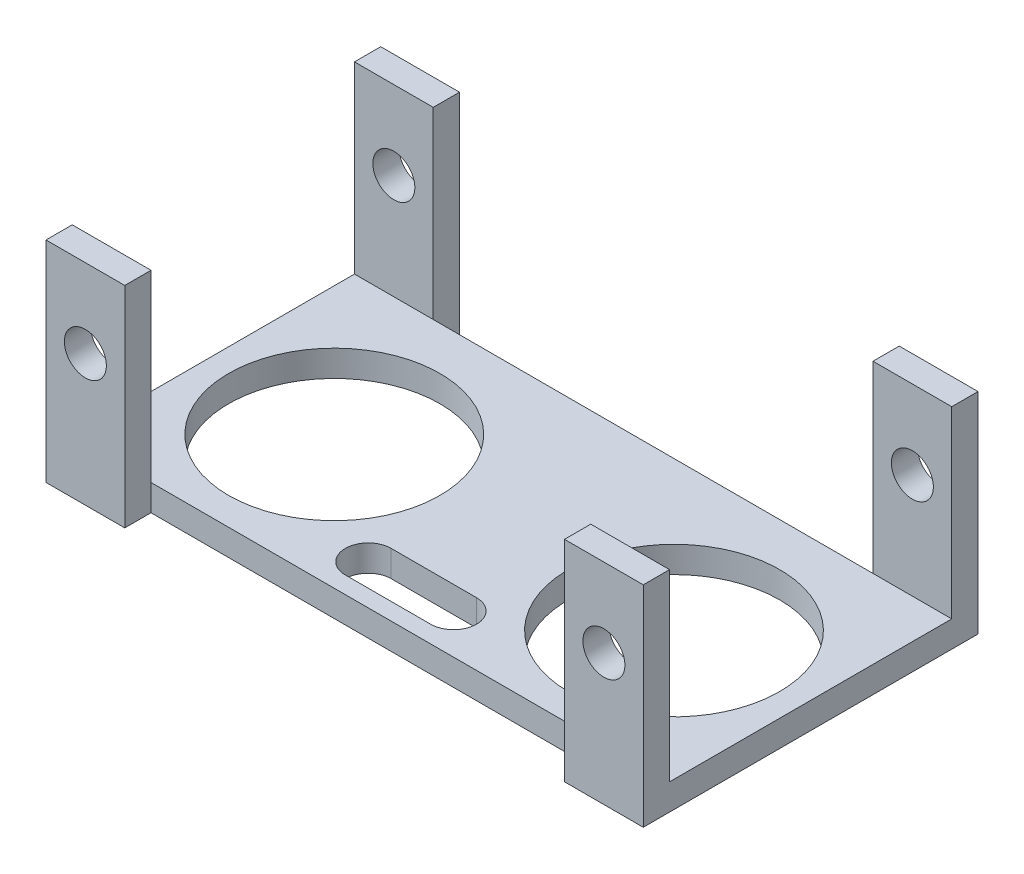
ISO-10303-21;
HEADER;
FILE_DESCRIPTION(('STEP AP214'),'2;1');
FILE_NAME('part.step','',(''),(''),'','','');
FILE_SCHEMA(('AUTOMOTIVE_DESIGN { 1 0 10303 214 1 1 1 1 }'));
ENDSEC;
DATA;
#1=APPLICATION_CONTEXT('core data for automotive mechanical design processes');
#2=APPLICATION_PROTOCOL_DEFINITION('international standard','automotive_design',2000,#1);
#3=PRODUCT_CONTEXT('',#1,'mechanical');
#4=PRODUCT('Part','Part','',(#3));
#5=PRODUCT_RELATED_PRODUCT_CATEGORY('part','',(#4));
#6=PRODUCT_DEFINITION_FORMATION('','',#4);
#7=PRODUCT_DEFINITION_CONTEXT('part definition',#1,'design');
#8=PRODUCT_DEFINITION('design','',#6,#7);
#9=PRODUCT_DEFINITION_SHAPE('','',#8);
#10=(LENGTH_UNIT() NAMED_UNIT(*) SI_UNIT(.MILLI.,.METRE.));
#11=(NAMED_UNIT(*) PLANE_ANGLE_UNIT() SI_UNIT($,.RADIAN.));
#12=(NAMED_UNIT(*) SI_UNIT($,.STERADIAN.) SOLID_ANGLE_UNIT());
#13=UNCERTAINTY_MEASURE_WITH_UNIT(LENGTH_MEASURE(1.E-05),#10,'distance_accuracy_value','');
#14=(GEOMETRIC_REPRESENTATION_CONTEXT(3) GLOBAL_UNCERTAINTY_ASSIGNED_CONTEXT((#13)) GLOBAL_UNIT_ASSIGNED_CONTEXT((#10,
#11,#12)) REPRESENTATION_CONTEXT('',''));
#15=CARTESIAN_POINT('',(0.,0.,0.));
#16=DIRECTION('',(0.,0.,1.));
#17=DIRECTION('',(1.,0.,0.));
#18=AXIS2_PLACEMENT_3D('',#15,#16,#17);
#19=CARTESIAN_POINT('',(22.75,1.,10.75));
#20=DIRECTION('',(0.,0.,-1.));
#21=DIRECTION('',(-1.,0.,0.));
#22=AXIS2_PLACEMENT_3D('',#19,#20,#21);
#23=PLANE('',#22);
#24=DIRECTION('',(0.,-1.,0.));
#25=VECTOR('',#24,1.);
#26=CARTESIAN_POINT('',(16.75,0.,10.75));
#27=LINE('',#26,#25);
#28=CARTESIAN_POINT('',(16.75,1.,10.75));
#29=VERTEX_POINT('',#28);
#30=CARTESIAN_POINT('',(16.75,-1.,10.75));
#31=VERTEX_POINT('',#30);
#32=EDGE_CURVE('E348',#29,#31,#27,.T.);
#33=ORIENTED_EDGE('',*,*,#32,.F.);
#34=DIRECTION('',(1.,0.,0.));
#35=VECTOR('',#34,1.);
#36=CARTESIAN_POINT('',(22.75,1.,10.75));
#37=LINE('',#36,#35);
#38=CARTESIAN_POINT('',(-16.75,0.999999999999999,10.75));
#39=VERTEX_POINT('',#38);
#40=EDGE_CURVE('E381',#39,#29,#37,.T.);
#41=ORIENTED_EDGE('',*,*,#40,.F.);
#42=DIRECTION('',(0.,1.,0.));
#43=VECTOR('',#42,1.);
#44=CARTESIAN_POINT('',(-16.75,0.,10.75));
#45=LINE('',#44,#43);
#46=CARTESIAN_POINT('',(-16.75,-1.,10.75));
#47=VERTEX_POINT('',#46);
#48=EDGE_CURVE('E370',#47,#39,#45,.T.);
#49=ORIENTED_EDGE('',*,*,#48,.F.);
#50=DIRECTION('',(-1.,0.,0.));
#51=VECTOR('',#50,1.);
#52=CARTESIAN_POINT('',(16.75,-1.,10.75));
#53=LINE('',#52,#51);
#54=EDGE_CURVE('E248',#31,#47,#53,.T.);
#55=ORIENTED_EDGE('',*,*,#54,.F.);
#56=EDGE_LOOP('',(#33,#41,#49,#55));
#57=FACE_BOUND('',#56,.T.);
#58=ADVANCED_FACE('F34',(#57),#23,.F.);
#59=CARTESIAN_POINT('',(-22.75,1.,10.75));
#60=DIRECTION('',(1.,0.,0.));
#61=DIRECTION('',(0.,0.,-1.));
#62=AXIS2_PLACEMENT_3D('',#59,#60,#61);
#63=PLANE('',#62);
#64=DIRECTION('',(0.,-1.,0.));
#65=VECTOR('',#64,1.);
#66=CARTESIAN_POINT('',(-22.75,0.,-12.75));
#67=LINE('',#66,#65);
#68=CARTESIAN_POINT('',(-22.75,15.,-12.75));
#69=VERTEX_POINT('',#68);
#70=CARTESIAN_POINT('',(-22.75,-1.,-12.75));
#71=VERTEX_POINT('',#70);
#72=EDGE_CURVE('E315',#69,#71,#67,.T.);
#73=ORIENTED_EDGE('',*,*,#72,.T.);
#74=DIRECTION('',(0.,0.,-1.));
#75=VECTOR('',#74,1.);
#76=CARTESIAN_POINT('',(-22.75,-1.,12.75));
#77=LINE('',#76,#75);
#78=CARTESIAN_POINT('',(-22.75,-1.,12.75));
#79=VERTEX_POINT('',#78);
#80=EDGE_CURVE('E221',#79,#71,#77,.T.);
#81=ORIENTED_EDGE('',*,*,#80,.F.);
#82=DIRECTION('',(0.,-1.,0.));
#83=VECTOR('',#82,1.);
#84=CARTESIAN_POINT('',(-22.75,0.,12.75));
#85=LINE('',#84,#83);
#86=CARTESIAN_POINT('',(-22.75,15.,12.75));
#87=VERTEX_POINT('',#86);
#88=EDGE_CURVE('E359',#87,#79,#85,.T.);
#89=ORIENTED_EDGE('',*,*,#88,.F.);
#90=DIRECTION('',(0.,0.,-1.));
#91=VECTOR('',#90,1.);
#92=CARTESIAN_POINT('',(-22.75,15.,12.75));
#93=LINE('',#92,#91);
#94=CARTESIAN_POINT('',(-22.75,15.,10.75));
#95=VERTEX_POINT('',#94);
#96=EDGE_CURVE('E366',#87,#95,#93,.T.);
#97=ORIENTED_EDGE('',*,*,#96,.T.);
#98=DIRECTION('',(0.,-1.,0.));
#99=VECTOR('',#98,1.);
#100=CARTESIAN_POINT('',(-22.75,0.,10.75));
#101=LINE('',#100,#99);
#102=CARTESIAN_POINT('',(-22.75,1.,10.75));
#103=VERTEX_POINT('',#102);
#104=EDGE_CURVE('E358',#95,#103,#101,.T.);
#105=ORIENTED_EDGE('',*,*,#104,.T.);
#106=DIRECTION('',(0.,0.,1.));
#107=VECTOR('',#106,1.);
#108=CARTESIAN_POINT('',(-22.75,1.,10.75));
#109=LINE('',#108,#107);
#110=CARTESIAN_POINT('',(-22.75,1.,-10.75));
#111=VERTEX_POINT('',#110);
#112=EDGE_CURVE('E379',#111,#103,#109,.T.);
#113=ORIENTED_EDGE('',*,*,#112,.F.);
#114=DIRECTION('',(0.,-1.,0.));
#115=VECTOR('',#114,1.);
#116=CARTESIAN_POINT('',(-22.75,0.,-10.75));
#117=LINE('',#116,#115);
#118=CARTESIAN_POINT('',(-22.75,15.,-10.75));
#119=VERTEX_POINT('',#118);
#120=EDGE_CURVE('E314',#119,#111,#117,.T.);
#121=ORIENTED_EDGE('',*,*,#120,.F.);
#122=DIRECTION('',(0.,0.,1.));
#123=VECTOR('',#122,1.);
#124=CARTESIAN_POINT('',(-22.75,15.,-12.75));
#125=LINE('',#124,#123);
#126=EDGE_CURVE('E333',#69,#119,#125,.T.);
#127=ORIENTED_EDGE('',*,*,#126,.F.);
#128=EDGE_LOOP('',(#73,#81,#89,#97,#105,#113,#121,#127));
#129=FACE_BOUND('',#128,.T.);
#130=ADVANCED_FACE('F36',(#129),#63,.F.);
#131=CARTESIAN_POINT('',(22.75,1.,10.75));
#132=DIRECTION('',(-1.,0.,0.));
#133=DIRECTION('',(0.,0.,1.));
#134=AXIS2_PLACEMENT_3D('',#131,#132,#133);
#135=PLANE('',#134);
#136=DIRECTION('',(0.,1.,0.));
#137=VECTOR('',#136,1.);
#138=CARTESIAN_POINT('',(22.75,0.,12.75));
#139=LINE('',#138,#137);
#140=CARTESIAN_POINT('',(22.75,-1.,12.75));
#141=VERTEX_POINT('',#140);
#142=CARTESIAN_POINT('',(22.75,15.,12.75));
#143=VERTEX_POINT('',#142);
#144=EDGE_CURVE('E336',#141,#143,#139,.T.);
#145=ORIENTED_EDGE('',*,*,#144,.F.);
#146=DIRECTION('',(0.,0.,1.));
#147=VECTOR('',#146,1.);
#148=CARTESIAN_POINT('',(22.75,-1.,-12.75));
#149=LINE('',#148,#147);
#150=CARTESIAN_POINT('',(22.75,-1.,-12.75));
#151=VERTEX_POINT('',#150);
#152=EDGE_CURVE('E239',#151,#141,#149,.T.);
#153=ORIENTED_EDGE('',*,*,#152,.F.);
#154=DIRECTION('',(0.,1.,0.));
#155=VECTOR('',#154,1.);
#156=CARTESIAN_POINT('',(22.75,0.,-12.75));
#157=LINE('',#156,#155);
#158=CARTESIAN_POINT('',(22.75,15.,-12.75));
#159=VERTEX_POINT('',#158);
#160=EDGE_CURVE('E293',#151,#159,#157,.T.);
#161=ORIENTED_EDGE('',*,*,#160,.T.);
#162=DIRECTION('',(0.,0.,1.));
#163=VECTOR('',#162,1.);
#164=CARTESIAN_POINT('',(22.75,15.,-12.75));
#165=LINE('',#164,#163);
#166=CARTESIAN_POINT('',(22.75,15.,-10.75));
#167=VERTEX_POINT('',#166);
#168=EDGE_CURVE('E302',#159,#167,#165,.T.);
#169=ORIENTED_EDGE('',*,*,#168,.T.);
#170=DIRECTION('',(0.,1.,0.));
#171=VECTOR('',#170,1.);
#172=CARTESIAN_POINT('',(22.75,0.,-10.75));
#173=LINE('',#172,#171);
#174=CARTESIAN_POINT('',(22.75,1.,-10.75));
#175=VERTEX_POINT('',#174);
#176=EDGE_CURVE('E290',#175,#167,#173,.T.);
#177=ORIENTED_EDGE('',*,*,#176,.F.);
#178=DIRECTION('',(0.,0.,-1.));
#179=VECTOR('',#178,1.);
#180=CARTESIAN_POINT('',(22.75,1.,10.75));
#181=LINE('',#180,#179);
#182=CARTESIAN_POINT('',(22.75,1.,10.75));
#183=VERTEX_POINT('',#182);
#184=EDGE_CURVE('E384',#183,#175,#181,.T.);
#185=ORIENTED_EDGE('',*,*,#184,.F.);
#186=DIRECTION('',(0.,1.,0.));
#187=VECTOR('',#186,1.);
#188=CARTESIAN_POINT('',(22.75,0.,10.75));
#189=LINE('',#188,#187);
#190=CARTESIAN_POINT('',(22.75,15.,10.75));
#191=VERTEX_POINT('',#190);
#192=EDGE_CURVE('E335',#183,#191,#189,.T.);
#193=ORIENTED_EDGE('',*,*,#192,.T.);
#194=DIRECTION('',(0.,0.,-1.));
#195=VECTOR('',#194,1.);
#196=CARTESIAN_POINT('',(22.75,15.,12.75));
#197=LINE('',#196,#195);
#198=EDGE_CURVE('E353',#143,#191,#197,.T.);
#199=ORIENTED_EDGE('',*,*,#198,.F.);
#200=EDGE_LOOP('',(#145,#153,#161,#169,#177,#185,#193,#199));
#201=FACE_BOUND('',#200,.T.);
#202=ADVANCED_FACE('F420',(#201),#135,.F.);
#203=CARTESIAN_POINT('',(22.75,1.,-10.75));
#204=DIRECTION('',(0.,0.,1.));
#205=DIRECTION('',(1.,0.,0.));
#206=AXIS2_PLACEMENT_3D('',#203,#204,#205);
#207=PLANE('',#206);
#208=DIRECTION('',(-1.,0.,0.));
#209=VECTOR('',#208,1.);
#210=CARTESIAN_POINT('',(22.75,1.,-10.75));
#211=LINE('',#210,#209);
#212=CARTESIAN_POINT('',(16.75,1.,-10.75));
#213=VERTEX_POINT('',#212);
#214=CARTESIAN_POINT('',(-16.75,1.,-10.75));
#215=VERTEX_POINT('',#214);
#216=EDGE_CURVE('E43',#213,#215,#211,.T.);
#217=ORIENTED_EDGE('',*,*,#216,.F.);
#218=DIRECTION('',(0.,-1.,0.));
#219=VECTOR('',#218,1.);
#220=CARTESIAN_POINT('',(16.75,0.,-10.75));
#221=LINE('',#220,#219);
#222=CARTESIAN_POINT('',(16.75,-1.,-10.75));
#223=VERTEX_POINT('',#222);
#224=EDGE_CURVE('E304',#213,#223,#221,.T.);
#225=ORIENTED_EDGE('',*,*,#224,.T.);
#226=DIRECTION('',(1.,0.,0.));
#227=VECTOR('',#226,1.);
#228=CARTESIAN_POINT('',(-16.75,-1.,-10.75));
#229=LINE('',#228,#227);
#230=CARTESIAN_POINT('',(-16.75,-1.,-10.75));
#231=VERTEX_POINT('',#230);
#232=EDGE_CURVE('E230',#231,#223,#229,.T.);
#233=ORIENTED_EDGE('',*,*,#232,.F.);
#234=DIRECTION('',(0.,1.,0.));
#235=VECTOR('',#234,1.);
#236=CARTESIAN_POINT('',(-16.75,0.,-10.75));
#237=LINE('',#236,#235);
#238=EDGE_CURVE('E318',#231,#215,#237,.T.);
#239=ORIENTED_EDGE('',*,*,#238,.T.);
#240=EDGE_LOOP('',(#217,#225,#233,#239));
#241=FACE_BOUND('',#240,.T.);
#242=ADVANCED_FACE('F402',(#241),#207,.F.);
#243=CARTESIAN_POINT('',(0.,1.,0.));
#244=DIRECTION('',(0.,1.,0.));
#245=DIRECTION('',(0.,0.,1.));
#246=AXIS2_PLACEMENT_3D('',#243,#244,#245);
#247=PLANE('',#246);
#248=CARTESIAN_POINT('',(-3.25,1.,7.7));
#249=DIRECTION('',(0.,1.,0.));
#250=DIRECTION('',(0.,0.,1.));
#251=AXIS2_PLACEMENT_3D('',#248,#249,#250);
#252=CIRCLE('',#251,1.75);
#253=CARTESIAN_POINT('',(-3.25,1.,5.95));
#254=VERTEX_POINT('',#253);
#255=CARTESIAN_POINT('',(-3.25,1.,9.45));
#256=VERTEX_POINT('',#255);
#257=EDGE_CURVE('E51',#254,#256,#252,.T.);
#258=ORIENTED_EDGE('',*,*,#257,.F.);
#259=DIRECTION('',(-1.,0.,0.));
#260=VECTOR('',#259,1.);
#261=CARTESIAN_POINT('',(-3.25,1.,5.95));
#262=LINE('',#261,#260);
#263=CARTESIAN_POINT('',(3.25,1.,5.95));
#264=VERTEX_POINT('',#263);
#265=EDGE_CURVE('E279',#264,#254,#262,.T.);
#266=ORIENTED_EDGE('',*,*,#265,.F.);
#267=CARTESIAN_POINT('',(3.25,1.,7.7));
#268=DIRECTION('',(0.,1.,0.));
#269=DIRECTION('',(0.,0.,1.));
#270=AXIS2_PLACEMENT_3D('',#267,#268,#269);
#271=CIRCLE('',#270,1.75);
#272=CARTESIAN_POINT('',(3.25,1.,9.45));
#273=VERTEX_POINT('',#272);
#274=EDGE_CURVE('E277',#273,#264,#271,.T.);
#275=ORIENTED_EDGE('',*,*,#274,.F.);
#276=DIRECTION('',(1.,0.,0.));
#277=VECTOR('',#276,1.);
#278=CARTESIAN_POINT('',(-3.25,1.,9.45));
#279=LINE('',#278,#277);
#280=EDGE_CURVE('E190',#256,#273,#279,.T.);
#281=ORIENTED_EDGE('',*,*,#280,.F.);
#282=EDGE_LOOP('',(#258,#266,#275,#281));
#283=FACE_BOUND('',#282,.T.);
#284=CARTESIAN_POINT('',(-12.94,1.,0.599999999999996));
#285=DIRECTION('',(0.,1.,0.));
#286=DIRECTION('',(0.,0.,1.));
#287=AXIS2_PLACEMENT_3D('',#284,#285,#286);
#288=CIRCLE('',#287,8.05);
#289=CARTESIAN_POINT('',(-12.94,1.,8.65));
#290=VERTEX_POINT('',#289);
#291=EDGE_CURVE('E287',#290,#290,#288,.T.);
#292=ORIENTED_EDGE('',*,*,#291,.F.);
#293=EDGE_LOOP('',(#292));
#294=FACE_BOUND('',#293,.T.);
#295=CARTESIAN_POINT('',(12.94,1.,0.599999999999993));
#296=DIRECTION('',(0.,1.,0.));
#297=DIRECTION('',(0.,0.,1.));
#298=AXIS2_PLACEMENT_3D('',#295,#296,#297);
#299=CIRCLE('',#298,8.05);
#300=CARTESIAN_POINT('',(12.94,1.,8.64999999999999));
#301=VERTEX_POINT('',#300);
#302=EDGE_CURVE('E284',#301,#301,#299,.T.);
#303=ORIENTED_EDGE('',*,*,#302,.F.);
#304=EDGE_LOOP('',(#303));
#305=FACE_BOUND('',#304,.T.);
#306=ORIENTED_EDGE('',*,*,#112,.T.);
#307=EDGE_CURVE('E382',#103,#39,#37,.T.);
#308=ORIENTED_EDGE('',*,*,#307,.T.);
#309=ORIENTED_EDGE('',*,*,#40,.T.);
#310=DIRECTION('',(1.,0.,0.));
#311=VECTOR('',#310,1.);
#312=CARTESIAN_POINT('',(0.,1.,10.75));
#313=LINE('',#312,#311);
#314=EDGE_CURVE('E356',#29,#183,#313,.T.);
#315=ORIENTED_EDGE('',*,*,#314,.T.);
#316=ORIENTED_EDGE('',*,*,#184,.T.);
#317=EDGE_CURVE('E11',#175,#213,#211,.T.);
#318=ORIENTED_EDGE('',*,*,#317,.T.);
#319=ORIENTED_EDGE('',*,*,#216,.T.);
#320=EDGE_CURVE('E44',#215,#111,#211,.T.);
#321=ORIENTED_EDGE('',*,*,#320,.T.);
#322=EDGE_LOOP('',(#306,#308,#309,#315,#316,#318,#319,#321));
#323=FACE_BOUND('',#322,.T.);
#324=ADVANCED_FACE('F392',(#283,#294,#305,#323),#247,.T.);
#325=CARTESIAN_POINT('',(0.,0.,10.75));
#326=DIRECTION('',(0.,0.,-1.));
#327=DIRECTION('',(-1.,0.,0.));
#328=AXIS2_PLACEMENT_3D('',#325,#326,#327);
#329=PLANE('',#328);
#330=CARTESIAN_POINT('',(-19.75,9.,10.75));
#331=DIRECTION('',(0.,0.,-1.));
#332=DIRECTION('',(-1.,0.,0.));
#333=AXIS2_PLACEMENT_3D('',#330,#331,#332);
#334=CIRCLE('',#333,1.6);
#335=CARTESIAN_POINT('',(-21.35,9.,10.75));
#336=VERTEX_POINT('',#335);
#337=EDGE_CURVE('E272',#336,#336,#334,.T.);
#338=ORIENTED_EDGE('',*,*,#337,.F.);
#339=EDGE_LOOP('',(#338));
#340=FACE_BOUND('',#339,.T.);
#341=ORIENTED_EDGE('',*,*,#307,.F.);
#342=ORIENTED_EDGE('',*,*,#104,.F.);
#343=DIRECTION('',(-1.,0.,0.));
#344=VECTOR('',#343,1.);
#345=CARTESIAN_POINT('',(-22.75,15.,10.75));
#346=LINE('',#345,#344);
#347=CARTESIAN_POINT('',(-16.75,15.,10.75));
#348=VERTEX_POINT('',#347);
#349=EDGE_CURVE('E362',#348,#95,#346,.T.);
#350=ORIENTED_EDGE('',*,*,#349,.F.);
#351=EDGE_CURVE('E369',#39,#348,#45,.T.);
#352=ORIENTED_EDGE('',*,*,#351,.F.);
#353=EDGE_LOOP('',(#341,#342,#350,#352));
#354=FACE_BOUND('',#353,.T.);
#355=ADVANCED_FACE('F458',(#340,#354),#329,.T.);
#356=CARTESIAN_POINT('',(-16.75,0.,12.75));
#357=DIRECTION('',(-1.,0.,0.));
#358=DIRECTION('',(0.,0.,1.));
#359=AXIS2_PLACEMENT_3D('',#356,#357,#358);
#360=PLANE('',#359);
#361=ORIENTED_EDGE('',*,*,#48,.T.);
#362=ORIENTED_EDGE('',*,*,#351,.T.);
#363=DIRECTION('',(0.,0.,-1.));
#364=VECTOR('',#363,1.);
#365=CARTESIAN_POINT('',(-16.75,15.,12.75));
#366=LINE('',#365,#364);
#367=CARTESIAN_POINT('',(-16.75,15.,12.75));
#368=VERTEX_POINT('',#367);
#369=EDGE_CURVE('E376',#368,#348,#366,.T.);
#370=ORIENTED_EDGE('',*,*,#369,.F.);
#371=DIRECTION('',(0.,1.,0.));
#372=VECTOR('',#371,1.);
#373=CARTESIAN_POINT('',(-16.75,0.,12.75));
#374=LINE('',#373,#372);
#375=CARTESIAN_POINT('',(-16.75,-1.,12.75));
#376=VERTEX_POINT('',#375);
#377=EDGE_CURVE('E361',#376,#368,#374,.T.);
#378=ORIENTED_EDGE('',*,*,#377,.F.);
#379=DIRECTION('',(0.,0.,1.));
#380=VECTOR('',#379,1.);
#381=CARTESIAN_POINT('',(-16.75,-1.,10.75));
#382=LINE('',#381,#380);
#383=EDGE_CURVE('E251',#47,#376,#382,.T.);
#384=ORIENTED_EDGE('',*,*,#383,.F.);
#385=EDGE_LOOP('',(#361,#362,#370,#378,#384));
#386=FACE_BOUND('',#385,.T.);
#387=ADVANCED_FACE('F438',(#386),#360,.F.);
#388=CARTESIAN_POINT('',(-22.75,15.,12.75));
#389=DIRECTION('',(0.,-1.,0.));
#390=DIRECTION('',(1.,0.,0.));
#391=AXIS2_PLACEMENT_3D('',#388,#389,#390);
#392=PLANE('',#391);
#393=ORIENTED_EDGE('',*,*,#349,.T.);
#394=ORIENTED_EDGE('',*,*,#96,.F.);
#395=DIRECTION('',(-1.,0.,0.));
#396=VECTOR('',#395,1.);
#397=CARTESIAN_POINT('',(-22.75,15.,12.75));
#398=LINE('',#397,#396);
#399=EDGE_CURVE('E364',#368,#87,#398,.T.);
#400=ORIENTED_EDGE('',*,*,#399,.F.);
#401=ORIENTED_EDGE('',*,*,#369,.T.);
#402=EDGE_LOOP('',(#393,#394,#400,#401));
#403=FACE_BOUND('',#402,.T.);
#404=ADVANCED_FACE('F461',(#403),#392,.F.);
#405=CARTESIAN_POINT('',(0.,0.,12.75));
#406=DIRECTION('',(0.,0.,-1.));
#407=DIRECTION('',(-1.,0.,0.));
#408=AXIS2_PLACEMENT_3D('',#405,#406,#407);
#409=PLANE('',#408);
#410=CARTESIAN_POINT('',(-19.75,9.,12.75));
#411=DIRECTION('',(0.,0.,-1.));
#412=DIRECTION('',(-1.,0.,0.));
#413=AXIS2_PLACEMENT_3D('',#410,#411,#412);
#414=CIRCLE('',#413,1.6);
#415=CARTESIAN_POINT('',(-21.35,9.,12.75));
#416=VERTEX_POINT('',#415);
#417=EDGE_CURVE('E255',#416,#416,#414,.T.);
#418=ORIENTED_EDGE('',*,*,#417,.T.);
#419=EDGE_LOOP('',(#418));
#420=FACE_BOUND('',#419,.T.);
#421=ORIENTED_EDGE('',*,*,#88,.T.);
#422=DIRECTION('',(-1.,0.,0.));
#423=VECTOR('',#422,1.);
#424=CARTESIAN_POINT('',(-16.75,-1.,12.75));
#425=LINE('',#424,#423);
#426=EDGE_CURVE('E218',#376,#79,#425,.T.);
#427=ORIENTED_EDGE('',*,*,#426,.F.);
#428=ORIENTED_EDGE('',*,*,#377,.T.);
#429=ORIENTED_EDGE('',*,*,#399,.T.);
#430=EDGE_LOOP('',(#421,#427,#428,#429));
#431=FACE_BOUND('',#430,.T.);
#432=ADVANCED_FACE('F442',(#420,#431),#409,.F.);
#433=CARTESIAN_POINT('',(22.75,15.,12.75));
#434=DIRECTION('',(0.,-1.,0.));
#435=DIRECTION('',(1.,0.,0.));
#436=AXIS2_PLACEMENT_3D('',#433,#434,#435);
#437=PLANE('',#436);
#438=DIRECTION('',(-1.,0.,0.));
#439=VECTOR('',#438,1.);
#440=CARTESIAN_POINT('',(22.75,15.,10.75));
#441=LINE('',#440,#439);
#442=CARTESIAN_POINT('',(16.75,15.,10.75));
#443=VERTEX_POINT('',#442);
#444=EDGE_CURVE('E346',#191,#443,#441,.T.);
#445=ORIENTED_EDGE('',*,*,#444,.T.);
#446=DIRECTION('',(0.,0.,-1.));
#447=VECTOR('',#446,1.);
#448=CARTESIAN_POINT('',(16.75,15.,12.75));
#449=LINE('',#448,#447);
#450=CARTESIAN_POINT('',(16.75,15.,12.75));
#451=VERTEX_POINT('',#450);
#452=EDGE_CURVE('E344',#451,#443,#449,.T.);
#453=ORIENTED_EDGE('',*,*,#452,.F.);
#454=DIRECTION('',(-1.,0.,0.));
#455=VECTOR('',#454,1.);
#456=CARTESIAN_POINT('',(22.75,15.,12.75));
#457=LINE('',#456,#455);
#458=EDGE_CURVE('E339',#143,#451,#457,.T.);
#459=ORIENTED_EDGE('',*,*,#458,.F.);
#460=ORIENTED_EDGE('',*,*,#198,.T.);
#461=EDGE_LOOP('',(#445,#453,#459,#460));
#462=FACE_BOUND('',#461,.T.);
#463=ADVANCED_FACE('F468',(#462),#437,.F.);
#464=CARTESIAN_POINT('',(16.75,0.,12.75));
#465=DIRECTION('',(1.,0.,0.));
#466=DIRECTION('',(0.,1.,0.));
#467=AXIS2_PLACEMENT_3D('',#464,#465,#466);
#468=PLANE('',#467);
#469=EDGE_CURVE('E340',#443,#29,#27,.T.);
#470=ORIENTED_EDGE('',*,*,#469,.T.);
#471=ORIENTED_EDGE('',*,*,#32,.T.);
#472=DIRECTION('',(0.,0.,-1.));
#473=VECTOR('',#472,1.);
#474=CARTESIAN_POINT('',(16.75,-1.,12.75));
#475=LINE('',#474,#473);
#476=CARTESIAN_POINT('',(16.75,-1.,12.75));
#477=VERTEX_POINT('',#476);
#478=EDGE_CURVE('E245',#477,#31,#475,.T.);
#479=ORIENTED_EDGE('',*,*,#478,.F.);
#480=DIRECTION('',(0.,-1.,0.));
#481=VECTOR('',#480,1.);
#482=CARTESIAN_POINT('',(16.75,0.,12.75));
#483=LINE('',#482,#481);
#484=EDGE_CURVE('E342',#451,#477,#483,.T.);
#485=ORIENTED_EDGE('',*,*,#484,.F.);
#486=ORIENTED_EDGE('',*,*,#452,.T.);
#487=EDGE_LOOP('',(#470,#471,#479,#485,#486));
#488=FACE_BOUND('',#487,.T.);
#489=ADVANCED_FACE('F429',(#488),#468,.F.);
#490=CARTESIAN_POINT('',(0.,0.,12.75));
#491=DIRECTION('',(0.,0.,1.));
#492=DIRECTION('',(1.,0.,0.));
#493=AXIS2_PLACEMENT_3D('',#490,#491,#492);
#494=PLANE('',#493);
#495=CARTESIAN_POINT('',(19.75,9.,12.75));
#496=DIRECTION('',(0.,0.,-1.));
#497=DIRECTION('',(-1.,0.,0.));
#498=AXIS2_PLACEMENT_3D('',#495,#496,#497);
#499=CIRCLE('',#498,1.6);
#500=CARTESIAN_POINT('',(18.15,9.,12.75));
#501=VERTEX_POINT('',#500);
#502=EDGE_CURVE('E261',#501,#501,#499,.T.);
#503=ORIENTED_EDGE('',*,*,#502,.T.);
#504=EDGE_LOOP('',(#503));
#505=FACE_BOUND('',#504,.T.);
#506=ORIENTED_EDGE('',*,*,#144,.T.);
#507=ORIENTED_EDGE('',*,*,#458,.T.);
#508=ORIENTED_EDGE('',*,*,#484,.T.);
#509=DIRECTION('',(-1.,0.,0.));
#510=VECTOR('',#509,1.);
#511=CARTESIAN_POINT('',(22.75,-1.,12.75));
#512=LINE('',#511,#510);
#513=EDGE_CURVE('E242',#141,#477,#512,.T.);
#514=ORIENTED_EDGE('',*,*,#513,.F.);
#515=EDGE_LOOP('',(#506,#507,#508,#514));
#516=FACE_BOUND('',#515,.T.);
#517=ADVANCED_FACE('F424',(#505,#516),#494,.T.);
#518=CARTESIAN_POINT('',(0.,0.,10.75));
#519=DIRECTION('',(0.,0.,1.));
#520=DIRECTION('',(1.,0.,0.));
#521=AXIS2_PLACEMENT_3D('',#518,#519,#520);
#522=PLANE('',#521);
#523=CARTESIAN_POINT('',(19.75,9.,10.75));
#524=DIRECTION('',(0.,0.,1.));
#525=DIRECTION('',(1.,0.,0.));
#526=AXIS2_PLACEMENT_3D('',#523,#524,#525);
#527=CIRCLE('',#526,1.6);
#528=CARTESIAN_POINT('',(21.35,9.,10.75));
#529=VERTEX_POINT('',#528);
#530=EDGE_CURVE('E266',#529,#529,#527,.T.);
#531=ORIENTED_EDGE('',*,*,#530,.T.);
#532=EDGE_LOOP('',(#531));
#533=FACE_BOUND('',#532,.T.);
#534=ORIENTED_EDGE('',*,*,#314,.F.);
#535=ORIENTED_EDGE('',*,*,#469,.F.);
#536=ORIENTED_EDGE('',*,*,#444,.F.);
#537=ORIENTED_EDGE('',*,*,#192,.F.);
#538=EDGE_LOOP('',(#534,#535,#536,#537));
#539=FACE_BOUND('',#538,.T.);
#540=ADVANCED_FACE('F548',(#533,#539),#522,.F.);
#541=CARTESIAN_POINT('',(0.,0.,-10.75));
#542=DIRECTION('',(0.,0.,1.));
#543=DIRECTION('',(-1.,0.,0.));
#544=AXIS2_PLACEMENT_3D('',#541,#542,#543);
#545=PLANE('',#544);
#546=CARTESIAN_POINT('',(-19.75,9.,-10.75));
#547=DIRECTION('',(0.,0.,1.));
#548=DIRECTION('',(1.,0.,0.));
#549=AXIS2_PLACEMENT_3D('',#546,#547,#548);
#550=CIRCLE('',#549,1.6);
#551=CARTESIAN_POINT('',(-18.15,9.,-10.75));
#552=VERTEX_POINT('',#551);
#553=EDGE_CURVE('E269',#552,#552,#550,.T.);
#554=ORIENTED_EDGE('',*,*,#553,.F.);
#555=EDGE_LOOP('',(#554));
#556=FACE_BOUND('',#555,.T.);
#557=ORIENTED_EDGE('',*,*,#320,.F.);
#558=CARTESIAN_POINT('',(-16.75,15.,-10.75));
#559=VERTEX_POINT('',#558);
#560=EDGE_CURVE('E329',#215,#559,#237,.T.);
#561=ORIENTED_EDGE('',*,*,#560,.T.);
#562=DIRECTION('',(-1.,0.,0.));
#563=VECTOR('',#562,1.);
#564=CARTESIAN_POINT('',(-22.75,15.,-10.75));
#565=LINE('',#564,#563);
#566=EDGE_CURVE('E326',#559,#119,#565,.T.);
#567=ORIENTED_EDGE('',*,*,#566,.T.);
#568=ORIENTED_EDGE('',*,*,#120,.T.);
#569=EDGE_LOOP('',(#557,#561,#567,#568));
#570=FACE_BOUND('',#569,.T.);
#571=ADVANCED_FACE('F399',(#556,#570),#545,.T.);
#572=CARTESIAN_POINT('',(-22.75,15.,-12.75));
#573=DIRECTION('',(0.,1.,0.));
#574=DIRECTION('',(-1.,0.,0.));
#575=AXIS2_PLACEMENT_3D('',#572,#573,#574);
#576=PLANE('',#575);
#577=ORIENTED_EDGE('',*,*,#566,.F.);
#578=DIRECTION('',(0.,0.,1.));
#579=VECTOR('',#578,1.);
#580=CARTESIAN_POINT('',(-16.75,15.,-12.75));
#581=LINE('',#580,#579);
#582=CARTESIAN_POINT('',(-16.75,15.,-12.75));
#583=VERTEX_POINT('',#582);
#584=EDGE_CURVE('E324',#583,#559,#581,.T.);
#585=ORIENTED_EDGE('',*,*,#584,.F.);
#586=DIRECTION('',(-1.,0.,0.));
#587=VECTOR('',#586,1.);
#588=CARTESIAN_POINT('',(-22.75,15.,-12.75));
#589=LINE('',#588,#587);
#590=EDGE_CURVE('E317',#583,#69,#589,.T.);
#591=ORIENTED_EDGE('',*,*,#590,.T.);
#592=ORIENTED_EDGE('',*,*,#126,.T.);
#593=EDGE_LOOP('',(#577,#585,#591,#592));
#594=FACE_BOUND('',#593,.T.);
#595=ADVANCED_FACE('F454',(#594),#576,.T.);
#596=CARTESIAN_POINT('',(-16.75,0.,-12.75));
#597=DIRECTION('',(1.,0.,0.));
#598=DIRECTION('',(0.,0.,-1.));
#599=AXIS2_PLACEMENT_3D('',#596,#597,#598);
#600=PLANE('',#599);
#601=ORIENTED_EDGE('',*,*,#238,.F.);
#602=DIRECTION('',(0.,0.,1.));
#603=VECTOR('',#602,1.);
#604=CARTESIAN_POINT('',(-16.75,-1.,-12.75));
#605=LINE('',#604,#603);
#606=CARTESIAN_POINT('',(-16.75,-1.,-12.75));
#607=VERTEX_POINT('',#606);
#608=EDGE_CURVE('E227',#607,#231,#605,.T.);
#609=ORIENTED_EDGE('',*,*,#608,.F.);
#610=DIRECTION('',(0.,1.,0.));
#611=VECTOR('',#610,1.);
#612=CARTESIAN_POINT('',(-16.75,0.,-12.75));
#613=LINE('',#612,#611);
#614=EDGE_CURVE('E321',#607,#583,#613,.T.);
#615=ORIENTED_EDGE('',*,*,#614,.T.);
#616=ORIENTED_EDGE('',*,*,#584,.T.);
#617=ORIENTED_EDGE('',*,*,#560,.F.);
#618=EDGE_LOOP('',(#601,#609,#615,#616,#617));
#619=FACE_BOUND('',#618,.T.);
#620=ADVANCED_FACE('F395',(#619),#600,.T.);
#621=CARTESIAN_POINT('',(0.,0.,-12.75));
#622=DIRECTION('',(0.,0.,1.));
#623=DIRECTION('',(-1.,0.,0.));
#624=AXIS2_PLACEMENT_3D('',#621,#622,#623);
#625=PLANE('',#624);
#626=CARTESIAN_POINT('',(-19.75,9.,-12.75));
#627=DIRECTION('',(0.,0.,-1.));
#628=DIRECTION('',(-1.,0.,0.));
#629=AXIS2_PLACEMENT_3D('',#626,#627,#628);
#630=CIRCLE('',#629,1.6);
#631=CARTESIAN_POINT('',(-21.35,9.,-12.75));
#632=VERTEX_POINT('',#631);
#633=EDGE_CURVE('E258',#632,#632,#630,.T.);
#634=ORIENTED_EDGE('',*,*,#633,.F.);
#635=EDGE_LOOP('',(#634));
#636=FACE_BOUND('',#635,.T.);
#637=ORIENTED_EDGE('',*,*,#72,.F.);
#638=ORIENTED_EDGE('',*,*,#590,.F.);
#639=ORIENTED_EDGE('',*,*,#614,.F.);
#640=DIRECTION('',(1.,0.,0.));
#641=VECTOR('',#640,1.);
#642=CARTESIAN_POINT('',(-22.75,-1.,-12.75));
#643=LINE('',#642,#641);
#644=EDGE_CURVE('E224',#71,#607,#643,.T.);
#645=ORIENTED_EDGE('',*,*,#644,.F.);
#646=EDGE_LOOP('',(#637,#638,#639,#645));
#647=FACE_BOUND('',#646,.T.);
#648=ADVANCED_FACE('F451',(#636,#647),#625,.F.);
#649=CARTESIAN_POINT('',(16.75,0.,-12.75));
#650=DIRECTION('',(-1.,0.,0.));
#651=DIRECTION('',(0.,-1.,0.));
#652=AXIS2_PLACEMENT_3D('',#649,#650,#651);
#653=PLANE('',#652);
#654=CARTESIAN_POINT('',(16.75,15.,-10.75));
#655=VERTEX_POINT('',#654);
#656=EDGE_CURVE('E305',#655,#213,#221,.T.);
#657=ORIENTED_EDGE('',*,*,#656,.F.);
#658=DIRECTION('',(0.,0.,1.));
#659=VECTOR('',#658,1.);
#660=CARTESIAN_POINT('',(16.75,15.,-12.75));
#661=LINE('',#660,#659);
#662=CARTESIAN_POINT('',(16.75,15.,-12.75));
#663=VERTEX_POINT('',#662);
#664=EDGE_CURVE('E312',#663,#655,#661,.T.);
#665=ORIENTED_EDGE('',*,*,#664,.F.);
#666=DIRECTION('',(0.,-1.,0.));
#667=VECTOR('',#666,1.);
#668=CARTESIAN_POINT('',(16.75,0.,-12.75));
#669=LINE('',#668,#667);
#670=CARTESIAN_POINT('',(16.75,-1.,-12.75));
#671=VERTEX_POINT('',#670);
#672=EDGE_CURVE('E296',#663,#671,#669,.T.);
#673=ORIENTED_EDGE('',*,*,#672,.T.);
#674=DIRECTION('',(0.,0.,-1.));
#675=VECTOR('',#674,1.);
#676=CARTESIAN_POINT('',(16.75,-1.,-10.75));
#677=LINE('',#676,#675);
#678=EDGE_CURVE('E233',#223,#671,#677,.T.);
#679=ORIENTED_EDGE('',*,*,#678,.F.);
#680=ORIENTED_EDGE('',*,*,#224,.F.);
#681=EDGE_LOOP('',(#657,#665,#673,#679,#680));
#682=FACE_BOUND('',#681,.T.);
#683=ADVANCED_FACE('F409',(#682),#653,.T.);
#684=CARTESIAN_POINT('',(22.75,15.,-12.75));
#685=DIRECTION('',(0.,1.,0.));
#686=DIRECTION('',(-1.,0.,0.));
#687=AXIS2_PLACEMENT_3D('',#684,#685,#686);
#688=PLANE('',#687);
#689=DIRECTION('',(-1.,0.,0.));
#690=VECTOR('',#689,1.);
#691=CARTESIAN_POINT('',(22.75,15.,-10.75));
#692=LINE('',#691,#690);
#693=EDGE_CURVE('E297',#167,#655,#692,.T.);
#694=ORIENTED_EDGE('',*,*,#693,.F.);
#695=ORIENTED_EDGE('',*,*,#168,.F.);
#696=DIRECTION('',(-1.,0.,0.));
#697=VECTOR('',#696,1.);
#698=CARTESIAN_POINT('',(22.75,15.,-12.75));
#699=LINE('',#698,#697);
#700=EDGE_CURVE('E299',#159,#663,#699,.T.);
#701=ORIENTED_EDGE('',*,*,#700,.T.);
#702=ORIENTED_EDGE('',*,*,#664,.T.);
#703=EDGE_LOOP('',(#694,#695,#701,#702));
#704=FACE_BOUND('',#703,.T.);
#705=ADVANCED_FACE('F416',(#704),#688,.T.);
#706=CARTESIAN_POINT('',(0.,0.,-12.75));
#707=DIRECTION('',(0.,0.,-1.));
#708=DIRECTION('',(1.,0.,0.));
#709=AXIS2_PLACEMENT_3D('',#706,#707,#708);
#710=PLANE('',#709);
#711=CARTESIAN_POINT('',(19.75,9.,-12.75));
#712=DIRECTION('',(0.,0.,-1.));
#713=DIRECTION('',(-1.,0.,0.));
#714=AXIS2_PLACEMENT_3D('',#711,#712,#713);
#715=CIRCLE('',#714,1.6);
#716=CARTESIAN_POINT('',(18.15,9.,-12.75));
#717=VERTEX_POINT('',#716);
#718=EDGE_CURVE('E254',#717,#717,#715,.T.);
#719=ORIENTED_EDGE('',*,*,#718,.F.);
#720=EDGE_LOOP('',(#719));
#721=FACE_BOUND('',#720,.T.);
#722=ORIENTED_EDGE('',*,*,#160,.F.);
#723=DIRECTION('',(1.,0.,0.));
#724=VECTOR('',#723,1.);
#725=CARTESIAN_POINT('',(16.75,-1.,-12.75));
#726=LINE('',#725,#724);
#727=EDGE_CURVE('E236',#671,#151,#726,.T.);
#728=ORIENTED_EDGE('',*,*,#727,.F.);
#729=ORIENTED_EDGE('',*,*,#672,.F.);
#730=ORIENTED_EDGE('',*,*,#700,.F.);
#731=EDGE_LOOP('',(#722,#728,#729,#730));
#732=FACE_BOUND('',#731,.T.);
#733=ADVANCED_FACE('F413',(#721,#732),#710,.T.);
#734=CARTESIAN_POINT('',(0.,0.,-10.75));
#735=DIRECTION('',(0.,0.,-1.));
#736=DIRECTION('',(1.,0.,0.));
#737=AXIS2_PLACEMENT_3D('',#734,#735,#736);
#738=PLANE('',#737);
#739=CARTESIAN_POINT('',(19.75,9.,-10.75));
#740=DIRECTION('',(0.,0.,-1.));
#741=DIRECTION('',(-1.,0.,0.));
#742=AXIS2_PLACEMENT_3D('',#739,#740,#741);
#743=CIRCLE('',#742,1.6);
#744=CARTESIAN_POINT('',(18.15,9.,-10.75));
#745=VERTEX_POINT('',#744);
#746=EDGE_CURVE('E38',#745,#745,#743,.T.);
#747=ORIENTED_EDGE('',*,*,#746,.T.);
#748=EDGE_LOOP('',(#747));
#749=FACE_BOUND('',#748,.T.);
#750=ORIENTED_EDGE('',*,*,#317,.F.);
#751=ORIENTED_EDGE('',*,*,#176,.T.);
#752=ORIENTED_EDGE('',*,*,#693,.T.);
#753=ORIENTED_EDGE('',*,*,#656,.T.);
#754=EDGE_LOOP('',(#750,#751,#752,#753));
#755=FACE_BOUND('',#754,.T.);
#756=ADVANCED_FACE('F498',(#749,#755),#738,.F.);
#757=CARTESIAN_POINT('',(12.94,0.,0.599999999999993));
#758=DIRECTION('',(0.,1.,0.));
#759=DIRECTION('',(0.,0.,1.));
#760=AXIS2_PLACEMENT_3D('',#757,#758,#759);
#761=CYLINDRICAL_SURFACE('',#760,8.05);
#762=ORIENTED_EDGE('',*,*,#302,.T.);
#763=EDGE_LOOP('',(#762));
#764=FACE_BOUND('',#763,.T.);
#765=CARTESIAN_POINT('',(12.94,-1.,0.599999999999993));
#766=DIRECTION('',(0.,-1.,0.));
#767=DIRECTION('',(0.,0.,-1.));
#768=AXIS2_PLACEMENT_3D('',#765,#766,#767);
#769=CIRCLE('',#768,8.05);
#770=CARTESIAN_POINT('',(12.94,-1.,-7.45000000000001));
#771=VERTEX_POINT('',#770);
#772=EDGE_CURVE('E203',#771,#771,#769,.T.);
#773=ORIENTED_EDGE('',*,*,#772,.T.);
#774=EDGE_LOOP('',(#773));
#775=FACE_BOUND('',#774,.T.);
#776=ADVANCED_FACE('F494',(#764,#775),#761,.F.);
#777=CARTESIAN_POINT('',(-12.94,0.,0.599999999999996));
#778=DIRECTION('',(0.,1.,0.));
#779=DIRECTION('',(0.,0.,1.));
#780=AXIS2_PLACEMENT_3D('',#777,#778,#779);
#781=CYLINDRICAL_SURFACE('',#780,8.05);
#782=ORIENTED_EDGE('',*,*,#291,.T.);
#783=EDGE_LOOP('',(#782));
#784=FACE_BOUND('',#783,.T.);
#785=CARTESIAN_POINT('',(-12.94,-1.,0.599999999999996));
#786=DIRECTION('',(0.,-1.,0.));
#787=DIRECTION('',(0.,0.,-1.));
#788=AXIS2_PLACEMENT_3D('',#785,#786,#787);
#789=CIRCLE('',#788,8.05);
#790=CARTESIAN_POINT('',(-12.94,-1.,-7.45));
#791=VERTEX_POINT('',#790);
#792=EDGE_CURVE('E215',#791,#791,#789,.T.);
#793=ORIENTED_EDGE('',*,*,#792,.T.);
#794=EDGE_LOOP('',(#793));
#795=FACE_BOUND('',#794,.T.);
#796=ADVANCED_FACE('F497',(#784,#795),#781,.F.);
#797=CARTESIAN_POINT('',(-3.25,0.,7.7));
#798=DIRECTION('',(0.,1.,0.));
#799=DIRECTION('',(0.,0.,1.));
#800=AXIS2_PLACEMENT_3D('',#797,#798,#799);
#801=CYLINDRICAL_SURFACE('',#800,1.75);
#802=ORIENTED_EDGE('',*,*,#257,.T.);
#803=DIRECTION('',(0.,1.,0.));
#804=VECTOR('',#803,1.);
#805=CARTESIAN_POINT('',(-3.25,0.,9.45));
#806=LINE('',#805,#804);
#807=CARTESIAN_POINT('',(-3.25,-1.,9.45));
#808=VERTEX_POINT('',#807);
#809=EDGE_CURVE('E195',#808,#256,#806,.T.);
#810=ORIENTED_EDGE('',*,*,#809,.F.);
#811=CARTESIAN_POINT('',(-3.25,-1.,7.7));
#812=DIRECTION('',(0.,-1.,0.));
#813=DIRECTION('',(0.,0.,-1.));
#814=AXIS2_PLACEMENT_3D('',#811,#812,#813);
#815=CIRCLE('',#814,1.75);
#816=CARTESIAN_POINT('',(-3.25,-1.,5.95));
#817=VERTEX_POINT('',#816);
#818=EDGE_CURVE('E208',#808,#817,#815,.T.);
#819=ORIENTED_EDGE('',*,*,#818,.T.);
#820=DIRECTION('',(0.,1.,0.));
#821=VECTOR('',#820,1.);
#822=CARTESIAN_POINT('',(-3.25,0.,5.95));
#823=LINE('',#822,#821);
#824=EDGE_CURVE('E282',#817,#254,#823,.T.);
#825=ORIENTED_EDGE('',*,*,#824,.T.);
#826=EDGE_LOOP('',(#802,#810,#819,#825));
#827=FACE_BOUND('',#826,.T.);
#828=ADVANCED_FACE('F522',(#827),#801,.F.);
#829=CARTESIAN_POINT('',(-3.25,0.,5.95));
#830=DIRECTION('',(0.,0.,-1.));
#831=DIRECTION('',(-1.,0.,0.));
#832=AXIS2_PLACEMENT_3D('',#829,#830,#831);
#833=PLANE('',#832);
#834=ORIENTED_EDGE('',*,*,#265,.T.);
#835=ORIENTED_EDGE('',*,*,#824,.F.);
#836=DIRECTION('',(1.,0.,0.));
#837=VECTOR('',#836,1.);
#838=CARTESIAN_POINT('',(3.25,-1.,5.95));
#839=LINE('',#838,#837);
#840=CARTESIAN_POINT('',(3.25,-1.,5.95));
#841=VERTEX_POINT('',#840);
#842=EDGE_CURVE('E210',#817,#841,#839,.T.);
#843=ORIENTED_EDGE('',*,*,#842,.T.);
#844=DIRECTION('',(0.,1.,0.));
#845=VECTOR('',#844,1.);
#846=CARTESIAN_POINT('',(3.25,0.,5.95));
#847=LINE('',#846,#845);
#848=EDGE_CURVE('E194',#841,#264,#847,.T.);
#849=ORIENTED_EDGE('',*,*,#848,.T.);
#850=EDGE_LOOP('',(#834,#835,#843,#849));
#851=FACE_BOUND('',#850,.T.);
#852=ADVANCED_FACE('F519',(#851),#833,.F.);
#853=CARTESIAN_POINT('',(3.25,0.,7.7));
#854=DIRECTION('',(0.,1.,0.));
#855=DIRECTION('',(0.,0.,1.));
#856=AXIS2_PLACEMENT_3D('',#853,#854,#855);
#857=CYLINDRICAL_SURFACE('',#856,1.75);
#858=ORIENTED_EDGE('',*,*,#274,.T.);
#859=ORIENTED_EDGE('',*,*,#848,.F.);
#860=CARTESIAN_POINT('',(3.25,-1.,7.7));
#861=DIRECTION('',(0.,-1.,0.));
#862=DIRECTION('',(0.,0.,-1.));
#863=AXIS2_PLACEMENT_3D('',#860,#861,#862);
#864=CIRCLE('',#863,1.75);
#865=CARTESIAN_POINT('',(3.25,-1.,9.45));
#866=VERTEX_POINT('',#865);
#867=EDGE_CURVE('E198',#841,#866,#864,.T.);
#868=ORIENTED_EDGE('',*,*,#867,.T.);
#869=DIRECTION('',(0.,1.,0.));
#870=VECTOR('',#869,1.);
#871=CARTESIAN_POINT('',(3.25,0.,9.45));
#872=LINE('',#871,#870);
#873=EDGE_CURVE('E183',#866,#273,#872,.T.);
#874=ORIENTED_EDGE('',*,*,#873,.T.);
#875=EDGE_LOOP('',(#858,#859,#868,#874));
#876=FACE_BOUND('',#875,.T.);
#877=ADVANCED_FACE('F199',(#876),#857,.F.);
#878=CARTESIAN_POINT('',(-3.25,0.,9.45));
#879=DIRECTION('',(0.,0.,1.));
#880=DIRECTION('',(1.,0.,0.));
#881=AXIS2_PLACEMENT_3D('',#878,#879,#880);
#882=PLANE('',#881);
#883=ORIENTED_EDGE('',*,*,#280,.T.);
#884=ORIENTED_EDGE('',*,*,#873,.F.);
#885=DIRECTION('',(-1.,0.,0.));
#886=VECTOR('',#885,1.);
#887=CARTESIAN_POINT('',(-3.25,-1.,9.45));
#888=LINE('',#887,#886);
#889=EDGE_CURVE('E187',#866,#808,#888,.T.);
#890=ORIENTED_EDGE('',*,*,#889,.T.);
#891=ORIENTED_EDGE('',*,*,#809,.T.);
#892=EDGE_LOOP('',(#883,#884,#890,#891));
#893=FACE_BOUND('',#892,.T.);
#894=ADVANCED_FACE('F185',(#893),#882,.F.);
#895=CARTESIAN_POINT('',(19.75,9.,12.75));
#896=DIRECTION('',(0.,0.,-1.));
#897=DIRECTION('',(-1.,0.,0.));
#898=AXIS2_PLACEMENT_3D('',#895,#896,#897);
#899=CYLINDRICAL_SURFACE('',#898,1.6);
#900=ORIENTED_EDGE('',*,*,#718,.T.);
#901=EDGE_LOOP('',(#900));
#902=FACE_BOUND('',#901,.T.);
#903=ORIENTED_EDGE('',*,*,#746,.F.);
#904=EDGE_LOOP('',(#903));
#905=FACE_BOUND('',#904,.T.);
#906=ADVANCED_FACE('F514',(#902,#905),#899,.F.);
#907=CARTESIAN_POINT('',(-19.75,9.,12.75));
#908=DIRECTION('',(0.,0.,-1.));
#909=DIRECTION('',(-1.,0.,0.));
#910=AXIS2_PLACEMENT_3D('',#907,#908,#909);
#911=CYLINDRICAL_SURFACE('',#910,1.6);
#912=ORIENTED_EDGE('',*,*,#553,.T.);
#913=EDGE_LOOP('',(#912));
#914=FACE_BOUND('',#913,.T.);
#915=ORIENTED_EDGE('',*,*,#633,.T.);
#916=EDGE_LOOP('',(#915));
#917=FACE_BOUND('',#916,.T.);
#918=ADVANCED_FACE('F511',(#914,#917),#911,.F.);
#919=ORIENTED_EDGE('',*,*,#502,.F.);
#920=EDGE_LOOP('',(#919));
#921=FACE_BOUND('',#920,.T.);
#922=ORIENTED_EDGE('',*,*,#530,.F.);
#923=EDGE_LOOP('',(#922));
#924=FACE_BOUND('',#923,.T.);
#925=ADVANCED_FACE('F508',(#921,#924),#899,.F.);
#926=ORIENTED_EDGE('',*,*,#337,.T.);
#927=EDGE_LOOP('',(#926));
#928=FACE_BOUND('',#927,.T.);
#929=ORIENTED_EDGE('',*,*,#417,.F.);
#930=EDGE_LOOP('',(#929));
#931=FACE_BOUND('',#930,.T.);
#932=ADVANCED_FACE('F503',(#928,#931),#911,.F.);
#933=CARTESIAN_POINT('',(0.,-1.,0.));
#934=DIRECTION('',(0.,-1.,0.));
#935=DIRECTION('',(0.,0.,-1.));
#936=AXIS2_PLACEMENT_3D('',#933,#934,#935);
#937=PLANE('',#936);
#938=ORIENTED_EDGE('',*,*,#889,.F.);
#939=ORIENTED_EDGE('',*,*,#867,.F.);
#940=ORIENTED_EDGE('',*,*,#842,.F.);
#941=ORIENTED_EDGE('',*,*,#818,.F.);
#942=EDGE_LOOP('',(#938,#939,#940,#941));
#943=FACE_BOUND('',#942,.T.);
#944=ORIENTED_EDGE('',*,*,#792,.F.);
#945=EDGE_LOOP('',(#944));
#946=FACE_BOUND('',#945,.T.);
#947=ORIENTED_EDGE('',*,*,#426,.T.);
#948=ORIENTED_EDGE('',*,*,#80,.T.);
#949=ORIENTED_EDGE('',*,*,#644,.T.);
#950=ORIENTED_EDGE('',*,*,#608,.T.);
#951=ORIENTED_EDGE('',*,*,#232,.T.);
#952=ORIENTED_EDGE('',*,*,#678,.T.);
#953=ORIENTED_EDGE('',*,*,#727,.T.);
#954=ORIENTED_EDGE('',*,*,#152,.T.);
#955=ORIENTED_EDGE('',*,*,#513,.T.);
#956=ORIENTED_EDGE('',*,*,#478,.T.);
#957=ORIENTED_EDGE('',*,*,#54,.T.);
#958=ORIENTED_EDGE('',*,*,#383,.T.);
#959=EDGE_LOOP('',(#947,#948,#949,#950,#951,#952,#953,#954,#955,#956,#957,#958));
#960=FACE_BOUND('',#959,.T.);
#961=ORIENTED_EDGE('',*,*,#772,.F.);
#962=EDGE_LOOP('',(#961));
#963=FACE_BOUND('',#962,.T.);
#964=ADVANCED_FACE('F205',(#943,#946,#960,#963),#937,.T.);
#965=CLOSED_SHELL('',(#58,#130,#202,#242,#324,#355,#387,#404,#432,#463,#489,#517,#540,#571,#595,
#620,#648,#683,#705,#733,#756,#776,#796,#828,#852,#877,#894,#906,#918,#925,#932,#964));
#966=MANIFOLD_SOLID_BREP('B2',#965);
#967=ADVANCED_BREP_SHAPE_REPRESENTATION('',(#18,#966),#14);
#968=SHAPE_DEFINITION_REPRESENTATION(#9,#967);
ENDSEC;
END-ISO-10303-21;
